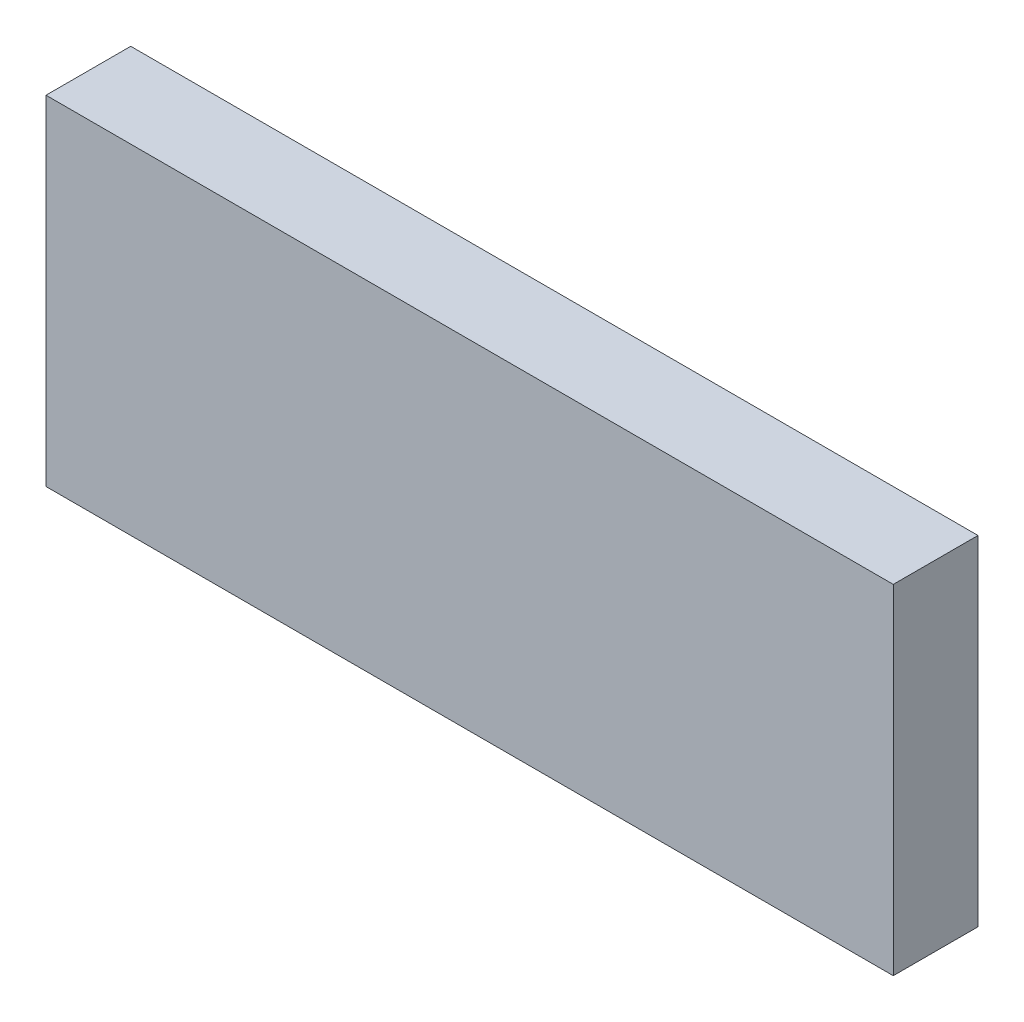
ISO-10303-21;
HEADER;
FILE_DESCRIPTION(('STEP AP214'),'2;1');
FILE_NAME('part.step','',(''),(''),'','','');
FILE_SCHEMA(('AUTOMOTIVE_DESIGN { 1 0 10303 214 1 1 1 1 }'));
ENDSEC;
DATA;
#1=APPLICATION_CONTEXT('core data for automotive mechanical design processes');
#2=APPLICATION_PROTOCOL_DEFINITION('international standard','automotive_design',2000,#1);
#3=PRODUCT_CONTEXT('',#1,'mechanical');
#4=PRODUCT('Part','Part','',(#3));
#5=PRODUCT_RELATED_PRODUCT_CATEGORY('part','',(#4));
#6=PRODUCT_DEFINITION_FORMATION('','',#4);
#7=PRODUCT_DEFINITION_CONTEXT('part definition',#1,'design');
#8=PRODUCT_DEFINITION('design','',#6,#7);
#9=PRODUCT_DEFINITION_SHAPE('','',#8);
#10=(LENGTH_UNIT() NAMED_UNIT(*) SI_UNIT(.MILLI.,.METRE.));
#11=(NAMED_UNIT(*) PLANE_ANGLE_UNIT() SI_UNIT($,.RADIAN.));
#12=(NAMED_UNIT(*) SI_UNIT($,.STERADIAN.) SOLID_ANGLE_UNIT());
#13=UNCERTAINTY_MEASURE_WITH_UNIT(LENGTH_MEASURE(1.E-05),#10,'distance_accuracy_value','');
#14=(GEOMETRIC_REPRESENTATION_CONTEXT(3) GLOBAL_UNCERTAINTY_ASSIGNED_CONTEXT((#13)) GLOBAL_UNIT_ASSIGNED_CONTEXT((#10,
#11,#12)) REPRESENTATION_CONTEXT('',''));
#15=CARTESIAN_POINT('',(0.,0.,0.));
#16=DIRECTION('',(0.,0.,1.));
#17=DIRECTION('',(1.,0.,0.));
#18=AXIS2_PLACEMENT_3D('',#15,#16,#17);
#19=CARTESIAN_POINT('',(0.,0.,50.));
#20=DIRECTION('',(1.,0.,0.));
#21=DIRECTION('',(0.,0.,-1.));
#22=AXIS2_PLACEMENT_3D('',#19,#20,#21);
#23=PLANE('',#22);
#24=DIRECTION('',(0.,-1.,0.));
#25=VECTOR('',#24,1.);
#26=CARTESIAN_POINT('',(0.,0.,0.));
#27=LINE('',#26,#25);
#28=CARTESIAN_POINT('',(0.,200.,0.));
#29=VERTEX_POINT('',#28);
#30=CARTESIAN_POINT('',(0.,0.,0.));
#31=VERTEX_POINT('',#30);
#32=EDGE_CURVE('E111',#29,#31,#27,.T.);
#33=ORIENTED_EDGE('',*,*,#32,.T.);
#34=DIRECTION('',(0.,0.,-1.));
#35=VECTOR('',#34,1.);
#36=CARTESIAN_POINT('',(0.,0.,50.));
#37=LINE('',#36,#35);
#38=CARTESIAN_POINT('',(0.,0.,50.));
#39=VERTEX_POINT('',#38);
#40=EDGE_CURVE('E11',#39,#31,#37,.T.);
#41=ORIENTED_EDGE('',*,*,#40,.F.);
#42=DIRECTION('',(0.,-1.,0.));
#43=VECTOR('',#42,1.);
#44=CARTESIAN_POINT('',(0.,0.,50.));
#45=LINE('',#44,#43);
#46=CARTESIAN_POINT('',(0.,200.,50.));
#47=VERTEX_POINT('',#46);
#48=EDGE_CURVE('E95',#47,#39,#45,.T.);
#49=ORIENTED_EDGE('',*,*,#48,.F.);
#50=DIRECTION('',(0.,0.,-1.));
#51=VECTOR('',#50,1.);
#52=CARTESIAN_POINT('',(0.,200.,50.));
#53=LINE('',#52,#51);
#54=EDGE_CURVE('E107',#47,#29,#53,.T.);
#55=ORIENTED_EDGE('',*,*,#54,.T.);
#56=EDGE_LOOP('',(#33,#41,#49,#55));
#57=FACE_BOUND('',#56,.T.);
#58=ADVANCED_FACE('F43',(#57),#23,.F.);
#59=CARTESIAN_POINT('',(0.,0.,50.));
#60=DIRECTION('',(0.,1.,0.));
#61=DIRECTION('',(0.,0.,1.));
#62=AXIS2_PLACEMENT_3D('',#59,#60,#61);
#63=PLANE('',#62);
#64=DIRECTION('',(1.,0.,0.));
#65=VECTOR('',#64,1.);
#66=CARTESIAN_POINT('',(0.,0.,0.));
#67=LINE('',#66,#65);
#68=CARTESIAN_POINT('',(500.,0.,0.));
#69=VERTEX_POINT('',#68);
#70=EDGE_CURVE('E100',#31,#69,#67,.T.);
#71=ORIENTED_EDGE('',*,*,#70,.T.);
#72=DIRECTION('',(0.,0.,-1.));
#73=VECTOR('',#72,1.);
#74=CARTESIAN_POINT('',(500.,0.,50.));
#75=LINE('',#74,#73);
#76=CARTESIAN_POINT('',(500.,0.,50.));
#77=VERTEX_POINT('',#76);
#78=EDGE_CURVE('E52',#77,#69,#75,.T.);
#79=ORIENTED_EDGE('',*,*,#78,.F.);
#80=DIRECTION('',(1.,0.,0.));
#81=VECTOR('',#80,1.);
#82=CARTESIAN_POINT('',(0.,0.,50.));
#83=LINE('',#82,#81);
#84=EDGE_CURVE('E90',#39,#77,#83,.T.);
#85=ORIENTED_EDGE('',*,*,#84,.F.);
#86=ORIENTED_EDGE('',*,*,#40,.T.);
#87=EDGE_LOOP('',(#71,#79,#85,#86));
#88=FACE_BOUND('',#87,.T.);
#89=ADVANCED_FACE('F99',(#88),#63,.F.);
#90=CARTESIAN_POINT('',(500.,0.,50.));
#91=DIRECTION('',(-1.,0.,0.));
#92=DIRECTION('',(0.,0.,1.));
#93=AXIS2_PLACEMENT_3D('',#90,#91,#92);
#94=PLANE('',#93);
#95=DIRECTION('',(0.,1.,0.));
#96=VECTOR('',#95,1.);
#97=CARTESIAN_POINT('',(500.,0.,0.));
#98=LINE('',#97,#96);
#99=CARTESIAN_POINT('',(500.,200.,0.));
#100=VERTEX_POINT('',#99);
#101=EDGE_CURVE('E77',#69,#100,#98,.T.);
#102=ORIENTED_EDGE('',*,*,#101,.T.);
#103=DIRECTION('',(0.,0.,-1.));
#104=VECTOR('',#103,1.);
#105=CARTESIAN_POINT('',(500.,200.,50.));
#106=LINE('',#105,#104);
#107=CARTESIAN_POINT('',(500.,200.,50.));
#108=VERTEX_POINT('',#107);
#109=EDGE_CURVE('E102',#108,#100,#106,.T.);
#110=ORIENTED_EDGE('',*,*,#109,.F.);
#111=DIRECTION('',(0.,1.,0.));
#112=VECTOR('',#111,1.);
#113=CARTESIAN_POINT('',(500.,0.,50.));
#114=LINE('',#113,#112);
#115=EDGE_CURVE('E93',#77,#108,#114,.T.);
#116=ORIENTED_EDGE('',*,*,#115,.F.);
#117=ORIENTED_EDGE('',*,*,#78,.T.);
#118=EDGE_LOOP('',(#102,#110,#116,#117));
#119=FACE_BOUND('',#118,.T.);
#120=ADVANCED_FACE('F103',(#119),#94,.F.);
#121=CARTESIAN_POINT('',(0.,200.,50.));
#122=DIRECTION('',(0.,-1.,0.));
#123=DIRECTION('',(0.,0.,-1.));
#124=AXIS2_PLACEMENT_3D('',#121,#122,#123);
#125=PLANE('',#124);
#126=DIRECTION('',(-1.,0.,0.));
#127=VECTOR('',#126,1.);
#128=CARTESIAN_POINT('',(0.,200.,0.));
#129=LINE('',#128,#127);
#130=EDGE_CURVE('E83',#100,#29,#129,.T.);
#131=ORIENTED_EDGE('',*,*,#130,.T.);
#132=ORIENTED_EDGE('',*,*,#54,.F.);
#133=DIRECTION('',(-1.,0.,0.));
#134=VECTOR('',#133,1.);
#135=CARTESIAN_POINT('',(0.,200.,50.));
#136=LINE('',#135,#134);
#137=EDGE_CURVE('E60',#108,#47,#136,.T.);
#138=ORIENTED_EDGE('',*,*,#137,.F.);
#139=ORIENTED_EDGE('',*,*,#109,.T.);
#140=EDGE_LOOP('',(#131,#132,#138,#139));
#141=FACE_BOUND('',#140,.T.);
#142=ADVANCED_FACE('F124',(#141),#125,.F.);
#143=CARTESIAN_POINT('',(0.,0.,50.));
#144=DIRECTION('',(0.,0.,-1.));
#145=DIRECTION('',(-1.,0.,0.));
#146=AXIS2_PLACEMENT_3D('',#143,#144,#145);
#147=PLANE('',#146);
#148=ORIENTED_EDGE('',*,*,#48,.T.);
#149=ORIENTED_EDGE('',*,*,#84,.T.);
#150=ORIENTED_EDGE('',*,*,#115,.T.);
#151=ORIENTED_EDGE('',*,*,#137,.T.);
#152=EDGE_LOOP('',(#148,#149,#150,#151));
#153=FACE_BOUND('',#152,.T.);
#154=ADVANCED_FACE('F91',(#153),#147,.F.);
#155=CARTESIAN_POINT('',(0.,0.,0.));
#156=DIRECTION('',(0.,0.,-1.));
#157=DIRECTION('',(-1.,0.,0.));
#158=AXIS2_PLACEMENT_3D('',#155,#156,#157);
#159=PLANE('',#158);
#160=ORIENTED_EDGE('',*,*,#32,.F.);
#161=ORIENTED_EDGE('',*,*,#130,.F.);
#162=ORIENTED_EDGE('',*,*,#101,.F.);
#163=ORIENTED_EDGE('',*,*,#70,.F.);
#164=EDGE_LOOP('',(#160,#161,#162,#163));
#165=FACE_BOUND('',#164,.T.);
#166=ADVANCED_FACE('F127',(#165),#159,.T.);
#167=CLOSED_SHELL('',(#58,#89,#120,#142,#154,#166));
#168=MANIFOLD_SOLID_BREP('B2',#167);
#169=ADVANCED_BREP_SHAPE_REPRESENTATION('',(#18,#168),#14);
#170=SHAPE_DEFINITION_REPRESENTATION(#9,#169);
ENDSEC;
END-ISO-10303-21;
